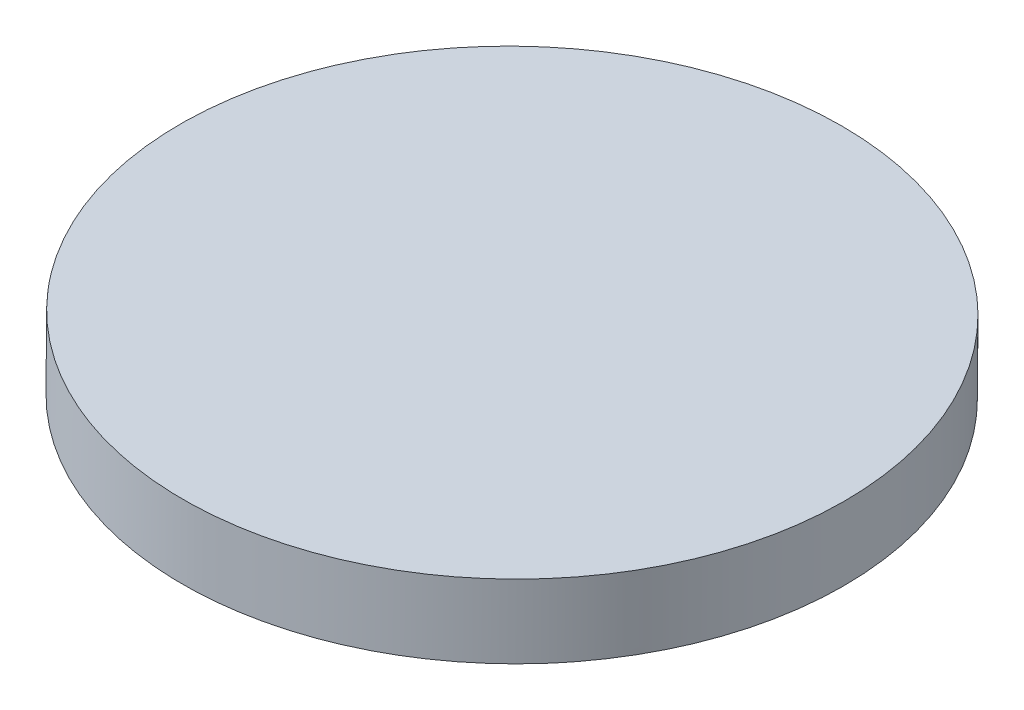
ISO-10303-21;
HEADER;
FILE_DESCRIPTION(('STEP AP214'),'2;1');
FILE_NAME('part.step','',(''),(''),'','','');
FILE_SCHEMA(('AUTOMOTIVE_DESIGN { 1 0 10303 214 1 1 1 1 }'));
ENDSEC;
DATA;
#1=APPLICATION_CONTEXT('core data for automotive mechanical design processes');
#2=APPLICATION_PROTOCOL_DEFINITION('international standard','automotive_design',2000,#1);
#3=PRODUCT_CONTEXT('',#1,'mechanical');
#4=PRODUCT('Part','Part','',(#3));
#5=PRODUCT_RELATED_PRODUCT_CATEGORY('part','',(#4));
#6=PRODUCT_DEFINITION_FORMATION('','',#4);
#7=PRODUCT_DEFINITION_CONTEXT('part definition',#1,'design');
#8=PRODUCT_DEFINITION('design','',#6,#7);
#9=PRODUCT_DEFINITION_SHAPE('','',#8);
#10=(LENGTH_UNIT() NAMED_UNIT(*) SI_UNIT(.MILLI.,.METRE.));
#11=(NAMED_UNIT(*) PLANE_ANGLE_UNIT() SI_UNIT($,.RADIAN.));
#12=(NAMED_UNIT(*) SI_UNIT($,.STERADIAN.) SOLID_ANGLE_UNIT());
#13=UNCERTAINTY_MEASURE_WITH_UNIT(LENGTH_MEASURE(1.E-05),#10,'distance_accuracy_value','');
#14=(GEOMETRIC_REPRESENTATION_CONTEXT(3) GLOBAL_UNCERTAINTY_ASSIGNED_CONTEXT((#13)) GLOBAL_UNIT_ASSIGNED_CONTEXT((#10,
#11,#12)) REPRESENTATION_CONTEXT('',''));
#15=CARTESIAN_POINT('',(0.,0.,0.));
#16=DIRECTION('',(0.,0.,1.));
#17=DIRECTION('',(1.,0.,0.));
#18=AXIS2_PLACEMENT_3D('',#15,#16,#17);
#19=CARTESIAN_POINT('',(-44.4553488898242,495.021376757719,709.143771462423));
#20=CARTESIAN_POINT('',(-42.2007824788043,495.021376757719,709.143771462423));
#21=CARTESIAN_POINT('',(-37.6916496567643,495.025252306551,709.58786537161));
#22=CARTESIAN_POINT('',(-31.1878755921047,495.042468873544,711.560688543134));
#23=CARTESIAN_POINT('',(-25.1939630857917,495.070427061266,714.764379534292));
#24=CARTESIAN_POINT('',(-19.940254834018,495.108052452243,719.075822296944));
#25=CARTESIAN_POINT('',(-15.6286478985858,495.1538991238,724.329330503605));
#26=CARTESIAN_POINT('',(-12.4248349160468,495.206205214061,730.323014780096));
#27=CARTESIAN_POINT('',(-10.4519366226008,495.262960629309,736.826541200968));
#28=CARTESIAN_POINT('',(-9.78577039325101,495.321984290767,743.589982893087));
#29=CARTESIAN_POINT('',(-10.4519366226008,495.381007952224,750.353424585205));
#30=CARTESIAN_POINT('',(-12.4248349160468,495.437763367473,756.856951006077));
#31=CARTESIAN_POINT('',(-15.6286478985858,495.490069457734,762.850635282568));
#32=CARTESIAN_POINT('',(-19.940254834018,495.53591612929,768.104143489229));
#33=CARTESIAN_POINT('',(-25.1939630857917,495.573541520268,772.415586251881));
#34=CARTESIAN_POINT('',(-31.1878755921047,495.60149970799,775.619277243039));
#35=CARTESIAN_POINT('',(-37.6916496567643,495.618716274982,777.592100414563));
#36=CARTESIAN_POINT('',(-44.4553488898243,495.624529598231,778.258241278344));
#37=CARTESIAN_POINT('',(-51.2190481228841,495.618716274982,777.592100414563));
#38=CARTESIAN_POINT('',(-57.7228221875438,495.60149970799,775.619277243039));
#39=CARTESIAN_POINT('',(-63.7167346938568,495.573541520268,772.415586251881));
#40=CARTESIAN_POINT('',(-68.9704429456305,495.53591612929,768.10414348923));
#41=CARTESIAN_POINT('',(-73.2820498810627,495.490069457733,762.850635282568));
#42=CARTESIAN_POINT('',(-76.4858628636017,495.437763367473,756.856951006077));
#43=CARTESIAN_POINT('',(-78.4587611570477,495.381007952224,750.353424585205));
#44=CARTESIAN_POINT('',(-79.1249273863975,495.321984290767,743.589982893087));
#45=CARTESIAN_POINT('',(-78.4587611570477,495.262960629309,736.826541200968));
#46=CARTESIAN_POINT('',(-76.4858628636017,495.206205214061,730.323014780096));
#47=CARTESIAN_POINT('',(-73.2820498810627,495.1538991238,724.329330503605));
#48=CARTESIAN_POINT('',(-68.9704429456305,495.108052452243,719.075822296944));
#49=CARTESIAN_POINT('',(-63.7167346938568,495.070427061266,714.764379534292));
#50=CARTESIAN_POINT('',(-57.7228221875438,495.042468873544,711.560688543134));
#51=CARTESIAN_POINT('',(-51.2190481228842,495.025252306551,709.58786537161));
#52=CARTESIAN_POINT('',(-46.7099153008442,495.021376757719,709.143771462423));
#53=CARTESIAN_POINT('',(-44.4553488898242,495.021376757719,709.143771462423));
#54=B_SPLINE_CURVE_WITH_KNOTS('',3,(#19,#20,#21,#22,#23,#24,#25,#26,#27,#28,#29,#30,#31,#32,#33,
#34,#35,#36,#37,#38,#39,#40,#41,#42,#43,#44,#45,#46,#47,#48,#49,#50,#51,#52,#53),.UNSPECIFIED.,
.T.,.F.,(4,1,1,1,1,1,1,1,1,1,1,1,1,1,1,1,1,1,1,1,1,1,1,1,1,1,1,1,1,1,1,1,4),(0.,0.03125,
0.0625000000000001,0.0937500000000001,0.125,0.15625,0.1875,0.21875,0.25,0.28125,0.3125,0.34375,
0.375,0.40625,0.4375,0.46875,0.5,0.53125,0.5625,0.59375,0.625,0.65625,0.6875,0.71875,0.75,
0.78125,0.8125,0.84375,0.875,0.90625,0.9375,0.96875,1.),.UNSPECIFIED.);
#55=DIRECTION('',(0.,-0.999961923064171,0.00872653549836411));
#56=VECTOR('',#55,1.);
#57=SURFACE_OF_LINEAR_EXTRUSION('',#54,#56);
#58=CARTESIAN_POINT('',(-44.4553488898242,495.021376757719,709.143771462423));
#59=CARTESIAN_POINT('',(-43.9087842156791,495.021376760877,709.143771824278));
#60=CARTESIAN_POINT('',(-43.3622231823304,495.021490642224,709.156821334032));
#61=CARTESIAN_POINT('',(-42.2703354994997,495.021945106356,709.208897765494));
#62=CARTESIAN_POINT('',(-41.7250088594797,495.022285690874,709.247924885654));
#63=CARTESIAN_POINT('',(-40.6368251111505,495.023192506665,709.351835683135));
#64=CARTESIAN_POINT('',(-40.0939680043984,495.023758738081,709.416719376757));
#65=CARTESIAN_POINT('',(-39.0119545200997,495.025115757896,709.572218445554));
#66=CARTESIAN_POINT('',(-38.472798115403,495.025906544646,709.662833631745));
#67=CARTESIAN_POINT('',(-37.3994247616508,495.027711746059,709.869689224927));
#68=CARTESIAN_POINT('',(-36.8652078040942,495.028726160338,709.985929587808));
#69=CARTESIAN_POINT('',(-35.802907247882,495.030975659541,710.2436966649));
#70=CARTESIAN_POINT('',(-35.2748236963346,495.032210746158,710.385223573189));
#71=CARTESIAN_POINT('',(-34.2259744269576,495.034898412772,710.693199662458));
#72=CARTESIAN_POINT('',(-33.7052087228605,495.036350993176,710.8596488902));
#73=CARTESIAN_POINT('',(-32.6721785473863,495.039470475503,711.217106159103));
#74=CARTESIAN_POINT('',(-32.1599140180307,495.041137375963,711.408114032695));
#75=CARTESIAN_POINT('',(-31.1450824868498,495.04468254561,711.814350236992));
#76=CARTESIAN_POINT('',(-30.6425154526424,495.046560814091,712.029578486803));
#77=CARTESIAN_POINT('',(-29.648195668651,495.050524022,712.483717131379));
#78=CARTESIAN_POINT('',(-29.1564429990948,495.052608962962,712.722627701762));
#79=CARTESIAN_POINT('',(-28.1848400818957,495.056980326987,713.223536404612));
#80=CARTESIAN_POINT('',(-27.70498987088,495.05926675067,713.485534608115));
#81=CARTESIAN_POINT('',(-26.7582820416752,495.064035963597,714.032032279505));
#82=CARTESIAN_POINT('',(-26.291424344182,495.066518751641,714.316531610008));
#83=CARTESIAN_POINT('',(-25.371809454715,495.071675779473,714.907468467971));
#84=CARTESIAN_POINT('',(-24.9190521954741,495.074350018347,715.21390589075));
#85=CARTESIAN_POINT('',(-24.0286475567006,495.079883682057,715.848000945463));
#86=CARTESIAN_POINT('',(-23.5910002805642,495.082743108158,716.17565872256));
#87=CARTESIAN_POINT('',(-22.7317632422954,495.088640154032,716.851393248972));
#88=CARTESIAN_POINT('',(-22.3101735476447,495.091677774553,717.199470084083));
#89=CARTESIAN_POINT('',(-21.4840078457913,495.097924350002,717.915256732702));
#90=CARTESIAN_POINT('',(-21.0794317497629,495.101133304035,718.282966443687));
#91=CARTESIAN_POINT('',(-20.2882680455911,495.107715830468,719.037249262107));
#92=CARTESIAN_POINT('',(-19.9016803303821,495.111089401888,719.42382225724));
#93=CARTESIAN_POINT('',(-19.1473687900905,495.117993520037,720.214955836322));
#94=CARTESIAN_POINT('',(-18.7796450773131,495.121524067701,720.619516527333));
#95=CARTESIAN_POINT('',(-18.0638311726939,495.128733632026,721.445650771328));
#96=CARTESIAN_POINT('',(-17.7157410833793,495.132412649462,721.867224413135));
#97=CARTESIAN_POINT('',(-17.0399808260869,495.139910811978,722.72642873429));
#98=CARTESIAN_POINT('',(-16.7123105723105,495.143729956469,723.164059346159));
#99=CARTESIAN_POINT('',(-16.0781913722822,495.151500104157,724.054430081052));
#100=CARTESIAN_POINT('',(-15.77174228086,495.155451106452,724.507170100684));
#101=CARTESIAN_POINT('',(-15.1807829209757,495.16347615843,725.426749974034));
#102=CARTESIAN_POINT('',(-14.8962727571978,495.167550208699,725.893589895015));
#103=CARTESIAN_POINT('',(-14.3497542760586,495.175811688178,726.840261676489));
#104=CARTESIAN_POINT('',(-14.0877460960863,495.179999118078,727.320093616282));
#105=CARTESIAN_POINT('',(-13.5868183194425,495.188477845425,728.291659537811));
#106=CARTESIAN_POINT('',(-13.3478986517324,495.192769142552,728.783393482921));
#107=CARTESIAN_POINT('',(-12.8937427142846,495.201446109444,729.777675406292));
#108=CARTESIAN_POINT('',(-12.6785062689224,495.205831778509,730.280223304328));
#109=CARTESIAN_POINT('',(-12.272254595826,495.21468774189,731.295016193722));
#110=CARTESIAN_POINT('',(-12.0812394489884,495.219158036489,731.807261217461));
#111=CARTESIAN_POINT('',(-11.7237685686181,495.228172810989,732.840252058729));
#112=CARTESIAN_POINT('',(-11.5573130026605,495.232717291397,733.360997934233));
#113=CARTESIAN_POINT('',(-11.2493251864268,495.241870111765,734.409807265088));
#114=CARTESIAN_POINT('',(-11.1077928893873,495.246478451605,734.937870706706));
#115=CARTESIAN_POINT('',(-10.850015995942,495.25574865517,736.000130819575));
#116=CARTESIAN_POINT('',(-10.7337712054503,495.260410518483,736.534327443718));
#117=CARTESIAN_POINT('',(-10.5269077392714,495.269777348968,737.607659905032));
#118=CARTESIAN_POINT('',(-10.4362891076969,495.274482316215,738.146795750703));
#119=CARTESIAN_POINT('',(-10.2807841038224,495.283924546001,739.228768116118));
#120=CARTESIAN_POINT('',(-10.2158979205149,495.288661808778,739.771604663012));
#121=CARTESIAN_POINT('',(-10.1119832182416,495.298157880252,740.85974667481));
#122=CARTESIAN_POINT('',(-10.0729546829733,495.302916688937,741.405052138158));
#123=CARTESIAN_POINT('',(-10.0208760745992,495.312445095391,742.496899371684));
#124=CARTESIAN_POINT('',(-10.0078258030343,495.317214693079,743.043441132385));
#125=CARTESIAN_POINT('',(-10.0078258030343,495.326753888455,744.136524653788));
#126=CARTESIAN_POINT('',(-10.0208760745992,495.331523486142,744.683066414489));
#127=CARTESIAN_POINT('',(-10.0729546829733,495.341051892597,745.774913648015));
#128=CARTESIAN_POINT('',(-10.1119832182416,495.345810701281,746.320219111363));
#129=CARTESIAN_POINT('',(-10.2158979205149,495.355306772756,747.408361123162));
#130=CARTESIAN_POINT('',(-10.2807841038224,495.360044035532,747.951197670055));
#131=CARTESIAN_POINT('',(-10.4362891076969,495.369486265319,749.03317003547));
#132=CARTESIAN_POINT('',(-10.5269077392714,495.374191232565,749.572305881141));
#133=CARTESIAN_POINT('',(-10.7337712054503,495.38355806305,750.645638342455));
#134=CARTESIAN_POINT('',(-10.850015995942,495.388219926364,751.179834966599));
#135=CARTESIAN_POINT('',(-11.1077928893873,495.397490129928,752.242095079467));
#136=CARTESIAN_POINT('',(-11.2493251864268,495.402098469768,752.770158521085));
#137=CARTESIAN_POINT('',(-11.5573130026605,495.411251290136,753.81896785194));
#138=CARTESIAN_POINT('',(-11.7237685686181,495.415795770544,754.339713727445));
#139=CARTESIAN_POINT('',(-12.0812394489884,495.424810545045,755.372704568712));
#140=CARTESIAN_POINT('',(-12.272254595826,495.429280839644,755.884949592452));
#141=CARTESIAN_POINT('',(-12.6785062689224,495.438136803025,756.899742481846));
#142=CARTESIAN_POINT('',(-12.8937427142846,495.442522472089,757.402290379881));
#143=CARTESIAN_POINT('',(-13.3478986517324,495.451199438981,758.396572303252));
#144=CARTESIAN_POINT('',(-13.5868183194426,495.455490736108,758.888306248362));
#145=CARTESIAN_POINT('',(-14.0877460960863,495.463969463456,759.859872169891));
#146=CARTESIAN_POINT('',(-14.3497542760586,495.468156893356,760.339704109684));
#147=CARTESIAN_POINT('',(-14.8962727571979,495.476418372834,761.286375891158));
#148=CARTESIAN_POINT('',(-15.1807829209758,495.480492423104,761.75321581214));
#149=CARTESIAN_POINT('',(-15.77174228086,495.488517475082,762.672795685489));
#150=CARTESIAN_POINT('',(-16.0781913722822,495.492468477377,763.125535705121));
#151=CARTESIAN_POINT('',(-16.7123105723105,495.500238625065,764.015906440015));
#152=CARTESIAN_POINT('',(-17.0399808260869,495.504057769556,764.453537051884));
#153=CARTESIAN_POINT('',(-17.7157410833793,495.511555932072,765.312741373039));
#154=CARTESIAN_POINT('',(-18.063831172694,495.515234949508,765.734315014846));
#155=CARTESIAN_POINT('',(-18.7796450773131,495.522444513833,766.560449258841));
#156=CARTESIAN_POINT('',(-19.1473687900906,495.525975061496,766.965009949851));
#157=CARTESIAN_POINT('',(-19.9016803303822,495.532879179646,767.756143528933));
#158=CARTESIAN_POINT('',(-20.2882680455911,495.536252751066,768.142716524066));
#159=CARTESIAN_POINT('',(-21.0794317497629,495.542835277499,768.896999342486));
#160=CARTESIAN_POINT('',(-21.4840078457913,495.546044231532,769.264709053471));
#161=CARTESIAN_POINT('',(-22.3101735476448,495.552290806981,769.98049570209));
#162=CARTESIAN_POINT('',(-22.7317632422954,495.555328427502,770.328572537201));
#163=CARTESIAN_POINT('',(-23.5910002805643,495.561225473376,771.004307063613));
#164=CARTESIAN_POINT('',(-24.0286475567005,495.564084899477,771.331964840711));
#165=CARTESIAN_POINT('',(-24.9190521954742,495.569618563186,771.966059895423));
#166=CARTESIAN_POINT('',(-25.3718094547154,495.572292802061,772.272497318203));
#167=CARTESIAN_POINT('',(-26.2914243441819,495.577449829893,772.863434176165));
#168=CARTESIAN_POINT('',(-26.7582820416742,495.579932617937,773.147933506668));
#169=CARTESIAN_POINT('',(-27.7049898708811,495.584701830863,773.694431178058));
#170=CARTESIAN_POINT('',(-28.1848400818997,495.586988254547,773.956429381562));
#171=CARTESIAN_POINT('',(-29.1564429990909,495.591359618572,774.457338084411));
#172=CARTESIAN_POINT('',(-29.6481956686361,495.593444559533,774.696248654792));
#173=CARTESIAN_POINT('',(-30.6425154526574,495.597407767443,775.150387299373));
#174=CARTESIAN_POINT('',(-31.1450824869057,495.599286035924,775.365615549191));
#175=CARTESIAN_POINT('',(-32.1599140179749,495.602831205571,775.771851753469));
#176=CARTESIAN_POINT('',(-32.6721785471779,495.60449810603,775.962859627035));
#177=CARTESIAN_POINT('',(-33.7052087230691,495.607617588357,776.320316896009));
#178=CARTESIAN_POINT('',(-34.2259744277357,495.609070168763,776.486766123849));
#179=CARTESIAN_POINT('',(-35.2748236955568,495.611757835374,776.79474221285));
#180=CARTESIAN_POINT('',(-35.8029072449788,495.612992921988,776.936269120774));
#181=CARTESIAN_POINT('',(-36.8652078069976,495.6152424212,777.194036198865));
#182=CARTESIAN_POINT('',(-37.3994247724863,495.61625683549,777.310276563111));
#183=CARTESIAN_POINT('',(-38.4727981045677,495.618062036871,777.517132152563));
#184=CARTESIAN_POINT('',(-39.0119544796614,495.618852823577,777.607747333658));
#185=CARTESIAN_POINT('',(-40.0939680448372,495.620209843513,777.763246416378));
#186=CARTESIAN_POINT('',(-40.6368252620703,495.620776075095,777.828130129019));
#187=CARTESIAN_POINT('',(-41.7250087085601,495.621682890433,777.932040874539));
#188=CARTESIAN_POINT('',(-42.27033493626,495.622023474332,777.97106792372));
#189=CARTESIAN_POINT('',(-43.3622237455659,495.622477940156,778.0231445491));
#190=CARTESIAN_POINT('',(-43.9087863176951,495.622591823814,778.036194323751));
#191=CARTESIAN_POINT('',(-45.0019114619535,495.622591823814,778.036194323751));
#192=CARTESIAN_POINT('',(-45.5484740340826,495.622477940156,778.0231445491));
#193=CARTESIAN_POINT('',(-46.6403628433886,495.622023474332,777.97106792372));
#194=CARTESIAN_POINT('',(-47.1856890710884,495.621682890433,777.932040874539));
#195=CARTESIAN_POINT('',(-48.2738725175783,495.620776075095,777.828130129019));
#196=CARTESIAN_POINT('',(-48.8167297348114,495.620209843513,777.763246416378));
#197=CARTESIAN_POINT('',(-49.8987432999871,495.618852823576,777.607747333658));
#198=CARTESIAN_POINT('',(-50.4378996750809,495.618062036871,777.517132152563));
#199=CARTESIAN_POINT('',(-51.5112730071623,495.61625683549,777.310276563111));
#200=CARTESIAN_POINT('',(-52.045489972651,495.6152424212,777.194036198865));
#201=CARTESIAN_POINT('',(-53.1077905346698,495.612992921988,776.936269120774));
#202=CARTESIAN_POINT('',(-53.6358740840918,495.611757835374,776.79474221285));
#203=CARTESIAN_POINT('',(-54.6847233519129,495.609070168763,776.486766123849));
#204=CARTESIAN_POINT('',(-55.2054890565794,495.607617588357,776.320316896009));
#205=CARTESIAN_POINT('',(-56.2385192324707,495.60449810603,775.962859627035));
#206=CARTESIAN_POINT('',(-56.7507837616736,495.602831205571,775.771851753469));
#207=CARTESIAN_POINT('',(-57.7656152927428,495.599286035924,775.365615549191));
#208=CARTESIAN_POINT('',(-58.2681823269912,495.597407767443,775.150387299373));
#209=CARTESIAN_POINT('',(-59.2625021110124,495.593444559533,774.696248654792));
#210=CARTESIAN_POINT('',(-59.7542547805577,495.591359618572,774.457338084411));
#211=CARTESIAN_POINT('',(-60.7258576977489,495.586988254547,773.956429381562));
#212=CARTESIAN_POINT('',(-61.2057079087674,495.584701830863,773.694431178058));
#213=CARTESIAN_POINT('',(-62.1524157379743,495.579932617937,773.147933506668));
#214=CARTESIAN_POINT('',(-62.6192734354667,495.577449829893,772.863434176165));
#215=CARTESIAN_POINT('',(-63.5388883249332,495.572292802061,772.272497318203));
#216=CARTESIAN_POINT('',(-63.9916455841744,495.569618563186,771.966059895423));
#217=CARTESIAN_POINT('',(-64.882050222948,495.564084899477,771.33196484071));
#218=CARTESIAN_POINT('',(-65.3196974990842,495.561225473376,771.004307063613));
#219=CARTESIAN_POINT('',(-66.1789345373531,495.555328427502,770.328572537201));
#220=CARTESIAN_POINT('',(-66.6005242320038,495.552290806981,769.98049570209));
#221=CARTESIAN_POINT('',(-67.4266899338573,495.546044231532,769.264709053471));
#222=CARTESIAN_POINT('',(-67.8312660298856,495.542835277499,768.896999342486));
#223=CARTESIAN_POINT('',(-68.6224297340574,495.536252751066,768.142716524066));
#224=CARTESIAN_POINT('',(-69.0090174492663,495.532879179646,767.756143528933));
#225=CARTESIAN_POINT('',(-69.763328989558,495.525975061496,766.965009949851));
#226=CARTESIAN_POINT('',(-70.1310527023354,495.522444513832,766.560449258841));
#227=CARTESIAN_POINT('',(-70.8468666069545,495.515234949508,765.734315014846));
#228=CARTESIAN_POINT('',(-71.1949566962692,495.511555932072,765.312741373039));
#229=CARTESIAN_POINT('',(-71.8707169535616,495.504057769556,764.453537051884));
#230=CARTESIAN_POINT('',(-72.198387207338,495.500238625065,764.015906440015));
#231=CARTESIAN_POINT('',(-72.8325064073663,495.492468477377,763.125535705121));
#232=CARTESIAN_POINT('',(-73.1389554987885,495.488517475082,762.672795685489));
#233=CARTESIAN_POINT('',(-73.7299148586728,495.480492423104,761.75321581214));
#234=CARTESIAN_POINT('',(-74.0144250224507,495.476418372834,761.286375891158));
#235=CARTESIAN_POINT('',(-74.5609435035899,495.468156893356,760.339704109684));
#236=CARTESIAN_POINT('',(-74.8229516835622,495.463969463456,759.859872169891));
#237=CARTESIAN_POINT('',(-75.323879460206,495.455490736108,758.888306248362));
#238=CARTESIAN_POINT('',(-75.5627991279161,495.451199438981,758.396572303252));
#239=CARTESIAN_POINT('',(-76.0169550653639,495.442522472089,757.402290379881));
#240=CARTESIAN_POINT('',(-76.2321915107261,495.438136803025,756.899742481846));
#241=CARTESIAN_POINT('',(-76.6384431838225,495.429280839644,755.884949592451));
#242=CARTESIAN_POINT('',(-76.8294583306601,495.424810545045,755.372704568712));
#243=CARTESIAN_POINT('',(-77.1869292110304,495.415795770544,754.339713727444));
#244=CARTESIAN_POINT('',(-77.353384776988,495.411251290136,753.81896785194));
#245=CARTESIAN_POINT('',(-77.6613725932217,495.402098469768,752.770158521085));
#246=CARTESIAN_POINT('',(-77.8029048902612,495.397490129928,752.242095079467));
#247=CARTESIAN_POINT('',(-78.0606817837065,495.388219926364,751.179834966598));
#248=CARTESIAN_POINT('',(-78.1769265741982,495.383558063051,750.645638342455));
#249=CARTESIAN_POINT('',(-78.3837900403771,495.374191232565,749.572305881141));
#250=CARTESIAN_POINT('',(-78.4744086719516,495.369486265319,749.03317003547));
#251=CARTESIAN_POINT('',(-78.6299136758261,495.360044035532,747.951197670055));
#252=CARTESIAN_POINT('',(-78.6947998591336,495.355306772756,747.408361123161));
#253=CARTESIAN_POINT('',(-78.7987145614069,495.345810701281,746.320219111363));
#254=CARTESIAN_POINT('',(-78.8377430966752,495.341051892597,745.774913648015));
#255=CARTESIAN_POINT('',(-78.8898217050493,495.331523486142,744.683066414489));
#256=CARTESIAN_POINT('',(-78.9028719766142,495.326753888455,744.136524653788));
#257=CARTESIAN_POINT('',(-78.9028719766142,495.317214693079,743.043441132385));
#258=CARTESIAN_POINT('',(-78.8898217050493,495.312445095391,742.496899371684));
#259=CARTESIAN_POINT('',(-78.8377430966752,495.302916688937,741.405052138159));
#260=CARTESIAN_POINT('',(-78.7987145614069,495.298157880252,740.85974667481));
#261=CARTESIAN_POINT('',(-78.6947998591336,495.288661808778,739.771604663012));
#262=CARTESIAN_POINT('',(-78.6299136758261,495.283924546001,739.228768116118));
#263=CARTESIAN_POINT('',(-78.4744086719516,495.274482316215,738.146795750704));
#264=CARTESIAN_POINT('',(-78.3837900403771,495.269777348968,737.607659905032));
#265=CARTESIAN_POINT('',(-78.1769265741982,495.260410518483,736.534327443718));
#266=CARTESIAN_POINT('',(-78.0606817837065,495.25574865517,736.000130819575));
#267=CARTESIAN_POINT('',(-77.8029048902612,495.246478451605,734.937870706706));
#268=CARTESIAN_POINT('',(-77.6613725932216,495.241870111765,734.409807265088));
#269=CARTESIAN_POINT('',(-77.353384776988,495.232717291397,733.360997934233));
#270=CARTESIAN_POINT('',(-77.1869292110304,495.228172810989,732.840252058729));
#271=CARTESIAN_POINT('',(-76.8294583306601,495.219158036488,731.807261217461));
#272=CARTESIAN_POINT('',(-76.6384431838225,495.21468774189,731.295016193722));
#273=CARTESIAN_POINT('',(-76.2321915107261,495.205831778509,730.280223304328));
#274=CARTESIAN_POINT('',(-76.0169550653639,495.201446109444,729.777675406292));
#275=CARTESIAN_POINT('',(-75.5627991279161,495.192769142552,728.783393482921));
#276=CARTESIAN_POINT('',(-75.3238794602059,495.188477845425,728.291659537811));
#277=CARTESIAN_POINT('',(-74.8229516835622,495.179999118078,727.320093616282));
#278=CARTESIAN_POINT('',(-74.5609435035899,495.175811688178,726.840261676489));
#279=CARTESIAN_POINT('',(-74.0144250224506,495.1675502087,725.893589895015));
#280=CARTESIAN_POINT('',(-73.7299148586728,495.16347615843,725.426749974033));
#281=CARTESIAN_POINT('',(-73.1389554987885,495.155451106452,724.507170100684));
#282=CARTESIAN_POINT('',(-72.8325064073663,495.151500104157,724.054430081052));
#283=CARTESIAN_POINT('',(-72.198387207338,495.143729956469,723.164059346159));
#284=CARTESIAN_POINT('',(-71.8707169535616,495.139910811978,722.72642873429));
#285=CARTESIAN_POINT('',(-71.1949566962692,495.132412649462,721.867224413134));
#286=CARTESIAN_POINT('',(-70.8468666069545,495.128733632026,721.445650771328));
#287=CARTESIAN_POINT('',(-70.1310527023354,495.121524067701,720.619516527333));
#288=CARTESIAN_POINT('',(-69.7633289895579,495.117993520037,720.214955836322));
#289=CARTESIAN_POINT('',(-69.0090174492663,495.111089401888,719.42382225724));
#290=CARTESIAN_POINT('',(-68.6224297340573,495.107715830468,719.037249262107));
#291=CARTESIAN_POINT('',(-67.8312660298856,495.101133304035,718.282966443687));
#292=CARTESIAN_POINT('',(-67.4266899338572,495.097924350001,717.915256732702));
#293=CARTESIAN_POINT('',(-66.6005242320037,495.091677774553,717.199470084083));
#294=CARTESIAN_POINT('',(-66.1789345373531,495.088640154032,716.851393248972));
#295=CARTESIAN_POINT('',(-65.3196974990842,495.082743108158,716.17565872256));
#296=CARTESIAN_POINT('',(-64.8820502229479,495.079883682057,715.848000945463));
#297=CARTESIAN_POINT('',(-63.9916455841744,495.074350018347,715.21390589075));
#298=CARTESIAN_POINT('',(-63.5388883249334,495.071675779473,714.907468467971));
#299=CARTESIAN_POINT('',(-62.6192734354663,495.066518751641,714.316531610008));
#300=CARTESIAN_POINT('',(-62.1524157379732,495.064035963597,714.032032279505));
#301=CARTESIAN_POINT('',(-61.2057079087685,495.059266750671,713.485534608115));
#302=CARTESIAN_POINT('',(-60.7258576977528,495.056980326987,713.223536404612));
#303=CARTESIAN_POINT('',(-59.7542547805536,495.052608962962,712.722627701762));
#304=CARTESIAN_POINT('',(-59.2625021109974,495.050524022,712.483717131379));
#305=CARTESIAN_POINT('',(-58.2681823270061,495.046560814091,712.029578486803));
#306=CARTESIAN_POINT('',(-57.7656152927986,495.04468254561,711.814350236992));
#307=CARTESIAN_POINT('',(-56.7507837616177,495.041137375963,711.408114032695));
#308=CARTESIAN_POINT('',(-56.2385192322622,495.039470475503,711.217106159103));
#309=CARTESIAN_POINT('',(-55.2054890567879,495.036350993177,710.8596488902));
#310=CARTESIAN_POINT('',(-54.6847233526908,495.034898412772,710.693199662458));
#311=CARTESIAN_POINT('',(-53.6358740833138,495.032210746158,710.385223573189));
#312=CARTESIAN_POINT('',(-53.1077905317664,495.030975659541,710.2436966649));
#313=CARTESIAN_POINT('',(-52.0454899755542,495.028726160338,709.985929587808));
#314=CARTESIAN_POINT('',(-51.5112730179976,495.027711746059,709.869689224927));
#315=CARTESIAN_POINT('',(-50.4378996642454,495.025906544646,709.662833631745));
#316=CARTESIAN_POINT('',(-49.8987432595487,495.025115757896,709.572218445554));
#317=CARTESIAN_POINT('',(-48.81672977525,495.023758738081,709.416719376756));
#318=CARTESIAN_POINT('',(-48.2738726684979,495.023192506665,709.351835683135));
#319=CARTESIAN_POINT('',(-47.1856889201687,495.022285690874,709.247924885654));
#320=CARTESIAN_POINT('',(-46.6403622801487,495.021945106356,709.208897765494));
#321=CARTESIAN_POINT('',(-45.548474597318,495.021490642223,709.156821334032));
#322=CARTESIAN_POINT('',(-45.0019135639693,495.021376760877,709.143771824278));
#323=CARTESIAN_POINT('',(-44.4553488898242,495.021376757719,709.143771462423));
#324=B_SPLINE_CURVE_WITH_KNOTS('',3,(#58,#59,#60,#61,#62,#63,#64,#65,#66,#67,#68,#69,#70,#71,
#72,#73,#74,#75,#76,#77,#78,#79,#80,#81,#82,#83,#84,#85,#86,#87,#88,#89,#90,#91,#92,#93,#94,#95,
#96,#97,#98,#99,#100,#101,#102,#103,#104,#105,#106,#107,#108,#109,#110,#111,#112,#113,#114,#115,
#116,#117,#118,#119,#120,#121,#122,#123,#124,#125,#126,#127,#128,#129,#130,#131,#132,#133,#134,
#135,#136,#137,#138,#139,#140,#141,#142,#143,#144,#145,#146,#147,#148,#149,#150,#151,#152,#153,
#154,#155,#156,#157,#158,#159,#160,#161,#162,#163,#164,#165,#166,#167,#168,#169,#170,#171,#172,
#173,#174,#175,#176,#177,#178,#179,#180,#181,#182,#183,#184,#185,#186,#187,#188,#189,#190,#191,
#192,#193,#194,#195,#196,#197,#198,#199,#200,#201,#202,#203,#204,#205,#206,#207,#208,#209,#210,
#211,#212,#213,#214,#215,#216,#217,#218,#219,#220,#221,#222,#223,#224,#225,#226,#227,#228,#229,
#230,#231,#232,#233,#234,#235,#236,#237,#238,#239,#240,#241,#242,#243,#244,#245,#246,#247,#248,
#249,#250,#251,#252,#253,#254,#255,#256,#257,#258,#259,#260,#261,#262,#263,#264,#265,#266,#267,
#268,#269,#270,#271,#272,#273,#274,#275,#276,#277,#278,#279,#280,#281,#282,#283,#284,#285,#286,
#287,#288,#289,#290,#291,#292,#293,#294,#295,#296,#297,#298,#299,#300,#301,#302,#303,#304,#305,
#306,#307,#308,#309,#310,#311,#312,#313,#314,#315,#316,#317,#318,#319,#320,#321,#322,#323),
.UNSPECIFIED.,.F.,.F.,(4,2,2,2,2,2,2,2,2,2,2,2,2,2,2,2,2,2,2,2,2,2,2,2,2,2,2,2,2,2,2,2,2,2,2,2,
2,2,2,2,2,2,2,2,2,2,2,2,2,2,2,2,2,2,2,2,2,2,2,2,2,2,2,2,2,2,2,2,2,2,2,2,2,2,2,2,2,2,2,2,2,2,2,2,
2,2,2,2,2,2,2,2,2,2,2,2,2,2,2,2,2,2,2,2,2,2,2,2,2,2,2,2,2,2,2,2,2,2,2,2,2,2,2,2,2,2,2,2,2,2,2,2,
4),(0.,1.63953351207137,3.27907954938383,4.91862662038178,6.55816165000279,8.19769385736451,
9.83723864896132,11.4767865168727,13.1163231984082,14.7558544042252,16.395397769004,
18.0349461785,19.6744845782721,21.3140151553127,22.9535569492843,24.5931056326655,
26.2326457551399,27.8721761179458,29.5117162404205,31.1512649238015,32.7908067177732,
34.4303372948136,36.0698756945858,37.7094241040816,39.3489674688603,40.9884986746775,
42.628035356213,44.2675832241243,45.9071280157214,47.5466602230828,49.1861952527039,
50.8257423237019,52.4652883610143,54.1048218730857,55.7443553851571,57.3839014224696,
59.0234484934676,60.6629835230887,62.3025157304503,63.9420605220471,65.5816083899585,
67.221145071494,68.860676277311,70.5002196420898,72.1397680515858,73.779306451358,
75.4188370283984,77.05837882237,78.6979275057509,80.3374676282255,81.9769979910315,
83.6165381135059,85.2560867968871,86.8956285908587,88.5351591678992,90.1746975676714,
91.8142459771674,93.4537893419462,95.0933205477633,96.7328572292988,98.3724050972101,
100.011949888807,101.651482096169,103.29101712579,104.930564196788,106.5701102341,
108.209643746171,109.849177258243,111.488723295555,113.128270366553,114.767805396174,
116.407337603536,118.046882395133,119.686430263044,121.32596694458,122.965498150397,
124.605041515175,126.244589924672,127.884128324444,129.523658901484,131.163200695456,
132.802749378837,134.442289501311,136.081819864117,137.721359986592,139.360908669973,
141.000450463944,142.639981040985,144.279519440757,145.919067850253,147.558611215032,
149.198142420849,150.837679102385,152.477226970296,154.116771761893,155.756303969254,
157.395838998875,159.035386069873,160.674932107186,162.314465619257,163.953999131328,
165.593545168641,167.233092239639,168.87262726926,170.512159476622,172.151704268218,
173.79125213613,175.430788817665,177.070320023483,178.709863388261,180.349411797757,
181.988950197529,183.62848077457,185.268022568541,186.907571251922,188.547111374397,
190.186641737203,191.826181859677,193.465730543059,195.10527233703,196.744802914071,
198.384341313843,200.023889723339,201.663433088118,203.302964293935,204.94250097547,
206.582048843381,208.221593634978,209.86112584234,211.500660871961,213.140207942959,
214.779753980271,216.419287492343),.UNSPECIFIED.);
#325=CARTESIAN_POINT('',(-44.4553488898242,495.021376757719,709.143771462423));
#326=VERTEX_POINT('',#325);
#327=EDGE_CURVE('E9',#326,#326,#324,.T.);
#328=ORIENTED_EDGE('',*,*,#327,.T.);
#329=EDGE_LOOP('',(#328));
#330=FACE_BOUND('',#329,.T.);
#331=CARTESIAN_POINT('',(-44.4553488898243,487.377474392513,709.210478787769));
#332=CARTESIAN_POINT('',(-45.0019135639694,487.377474395671,709.210479149624));
#333=CARTESIAN_POINT('',(-45.5484745973181,487.377588277017,709.223528659379));
#334=CARTESIAN_POINT('',(-46.6403622801488,487.37804274115,709.27560509084));
#335=CARTESIAN_POINT('',(-47.1856889201688,487.378383325667,709.314632211001));
#336=CARTESIAN_POINT('',(-48.273872668498,487.379290141459,709.418543008482));
#337=CARTESIAN_POINT('',(-48.8167297752501,487.379856372875,709.483426702103));
#338=CARTESIAN_POINT('',(-49.8987432595488,487.38121339269,709.638925770901));
#339=CARTESIAN_POINT('',(-50.4378996642455,487.38200417944,709.729540957091));
#340=CARTESIAN_POINT('',(-51.5112730179977,487.383809380853,709.936396550274));
#341=CARTESIAN_POINT('',(-52.0454899755543,487.384823795132,710.052636913155));
#342=CARTESIAN_POINT('',(-53.1077905317665,487.387073294335,710.310403990246));
#343=CARTESIAN_POINT('',(-53.6358740833139,487.388308380952,710.451930898535));
#344=CARTESIAN_POINT('',(-54.6847233526909,487.390996047566,710.759906987805));
#345=CARTESIAN_POINT('',(-55.205489056788,487.39244862797,710.926356215546));
#346=CARTESIAN_POINT('',(-56.2385192322623,487.395568110297,711.283813484449));
#347=CARTESIAN_POINT('',(-56.7507837616178,487.397235010757,711.474821358041));
#348=CARTESIAN_POINT('',(-57.7656152927987,487.400780180403,711.881057562338));
#349=CARTESIAN_POINT('',(-58.2681823270062,487.402658448884,712.096285812149));
#350=CARTESIAN_POINT('',(-59.2625021109975,487.406621656794,712.550424456725));
#351=CARTESIAN_POINT('',(-59.7542547805537,487.408706597756,712.789335027109));
#352=CARTESIAN_POINT('',(-60.7258576977528,487.413077961781,713.290243729959));
#353=CARTESIAN_POINT('',(-61.2057079087686,487.415364385464,713.552241933462));
#354=CARTESIAN_POINT('',(-62.1524157379733,487.42013359839,714.098739604852));
#355=CARTESIAN_POINT('',(-62.6192734354665,487.422616386434,714.383238935354));
#356=CARTESIAN_POINT('',(-63.5388883249335,487.427773414266,714.974175793317));
#357=CARTESIAN_POINT('',(-63.9916455841744,487.430447653141,715.280613216097));
#358=CARTESIAN_POINT('',(-64.882050222948,487.43598131685,715.914708270809));
#359=CARTESIAN_POINT('',(-65.3196974990843,487.438840742952,716.242366047906));
#360=CARTESIAN_POINT('',(-66.1789345373532,487.444737788825,716.918100574319));
#361=CARTESIAN_POINT('',(-66.6005242320038,487.447775409346,717.266177409429));
#362=CARTESIAN_POINT('',(-67.4266899338573,487.454021984795,717.981964058048));
#363=CARTESIAN_POINT('',(-67.8312660298857,487.457230938828,718.349673769034));
#364=CARTESIAN_POINT('',(-68.6224297340574,487.463813465261,719.103956587453));
#365=CARTESIAN_POINT('',(-69.0090174492663,487.467187036681,719.490529582587));
#366=CARTESIAN_POINT('',(-69.763328989558,487.474091154831,720.281663161669));
#367=CARTESIAN_POINT('',(-70.1310527023355,487.477621702495,720.686223852679));
#368=CARTESIAN_POINT('',(-70.8468666069546,487.48483126682,721.512358096674));
#369=CARTESIAN_POINT('',(-71.1949566962692,487.488510284256,721.933931738481));
#370=CARTESIAN_POINT('',(-71.8707169535616,487.496008446772,722.793136059636));
#371=CARTESIAN_POINT('',(-72.1983872073381,487.499827591263,723.230766671505));
#372=CARTESIAN_POINT('',(-72.8325064073664,487.507597738951,724.121137406399));
#373=CARTESIAN_POINT('',(-73.1389554987885,487.511548741246,724.573877426031));
#374=CARTESIAN_POINT('',(-73.7299148586728,487.519573793223,725.49345729938));
#375=CARTESIAN_POINT('',(-74.0144250224507,487.523647843493,725.960297220362));
#376=CARTESIAN_POINT('',(-74.56094350359,487.531909322971,726.906969001835));
#377=CARTESIAN_POINT('',(-74.8229516835622,487.536096752872,727.386800941628));
#378=CARTESIAN_POINT('',(-75.323879460206,487.544575480219,728.358366863158));
#379=CARTESIAN_POINT('',(-75.5627991279161,487.548866777346,728.850100808268));
#380=CARTESIAN_POINT('',(-76.0169550653639,487.557543744238,729.844382731639));
#381=CARTESIAN_POINT('',(-76.2321915107261,487.561929413303,730.346930629674));
#382=CARTESIAN_POINT('',(-76.6384431838225,487.570785376683,731.361723519069));
#383=CARTESIAN_POINT('',(-76.8294583306601,487.575255671282,731.873968542808));
#384=CARTESIAN_POINT('',(-77.1869292110304,487.584270445783,732.906959384075));
#385=CARTESIAN_POINT('',(-77.353384776988,487.588814926191,733.42770525958));
#386=CARTESIAN_POINT('',(-77.6613725932217,487.597967746559,734.476514590434));
#387=CARTESIAN_POINT('',(-77.8029048902612,487.602576086399,735.004578032053));
#388=CARTESIAN_POINT('',(-78.0606817837065,487.611846289964,736.066838144921));
#389=CARTESIAN_POINT('',(-78.1769265741982,487.616508153277,736.601034769065));
#390=CARTESIAN_POINT('',(-78.3837900403771,487.625874983762,737.674367230379));
#391=CARTESIAN_POINT('',(-78.4744086719516,487.630579951009,738.21350307605));
#392=CARTESIAN_POINT('',(-78.6299136758261,487.640022180795,739.295475441465));
#393=CARTESIAN_POINT('',(-78.6947998591336,487.644759443572,739.838311988358));
#394=CARTESIAN_POINT('',(-78.7987145614069,487.654255515046,740.926454000157));
#395=CARTESIAN_POINT('',(-78.8377430966752,487.65901432373,741.471759463505));
#396=CARTESIAN_POINT('',(-78.8898217050493,487.668542730185,742.563606697031));
#397=CARTESIAN_POINT('',(-78.9028719766142,487.673312327873,743.110148457732));
#398=CARTESIAN_POINT('',(-78.9028719766142,487.682851523248,744.203231979134));
#399=CARTESIAN_POINT('',(-78.8898217050493,487.687621120936,744.749773739836));
#400=CARTESIAN_POINT('',(-78.8377430966752,487.697149527391,745.841620973361));
#401=CARTESIAN_POINT('',(-78.7987145614069,487.701908336075,746.386926436709));
#402=CARTESIAN_POINT('',(-78.6947998591336,487.71140440755,747.475068448508));
#403=CARTESIAN_POINT('',(-78.6299136758261,487.716141670326,748.017904995402));
#404=CARTESIAN_POINT('',(-78.4744086719515,487.725583900112,749.099877360816));
#405=CARTESIAN_POINT('',(-78.3837900403771,487.730288867359,749.639013206487));
#406=CARTESIAN_POINT('',(-78.1769265741982,487.739655697844,750.712345667801));
#407=CARTESIAN_POINT('',(-78.0606817837065,487.744317561157,751.246542291945));
#408=CARTESIAN_POINT('',(-77.8029048902612,487.753587764722,752.308802404813));
#409=CARTESIAN_POINT('',(-77.6613725932216,487.758196104562,752.836865846432));
#410=CARTESIAN_POINT('',(-77.353384776988,487.76734892493,753.885675177287));
#411=CARTESIAN_POINT('',(-77.1869292110304,487.771893405338,754.406421052791));
#412=CARTESIAN_POINT('',(-76.8294583306601,487.780908179839,755.439411894059));
#413=CARTESIAN_POINT('',(-76.6384431838225,487.785378474438,755.951656917798));
#414=CARTESIAN_POINT('',(-76.2321915107261,487.794234437818,756.966449807192));
#415=CARTESIAN_POINT('',(-76.0169550653639,487.798620106883,757.468997705228));
#416=CARTESIAN_POINT('',(-75.5627991279161,487.807297073775,758.463279628598));
#417=CARTESIAN_POINT('',(-75.3238794602059,487.811588370902,758.955013573709));
#418=CARTESIAN_POINT('',(-74.8229516835622,487.820067098249,759.926579495238));
#419=CARTESIAN_POINT('',(-74.5609435035899,487.82425452815,760.406411435031));
#420=CARTESIAN_POINT('',(-74.0144250224506,487.832516007628,761.353083216505));
#421=CARTESIAN_POINT('',(-73.7299148586727,487.836590057898,761.819923137486));
#422=CARTESIAN_POINT('',(-73.1389554987884,487.844615109875,762.739503010836));
#423=CARTESIAN_POINT('',(-72.8325064073663,487.84856611217,763.192243030468));
#424=CARTESIAN_POINT('',(-72.198387207338,487.856336259858,764.082613765361));
#425=CARTESIAN_POINT('',(-71.8707169535615,487.86015540435,764.52024437723));
#426=CARTESIAN_POINT('',(-71.1949566962691,487.867653566865,765.379448698385));
#427=CARTESIAN_POINT('',(-70.8468666069545,487.871332584301,765.801022340192));
#428=CARTESIAN_POINT('',(-70.1310527023354,487.878542148626,766.627156584187));
#429=CARTESIAN_POINT('',(-69.7633289895579,487.88207269629,767.031717275198));
#430=CARTESIAN_POINT('',(-69.0090174492663,487.88897681444,767.82285085428));
#431=CARTESIAN_POINT('',(-68.6224297340573,487.89235038586,768.209423849413));
#432=CARTESIAN_POINT('',(-67.8312660298856,487.898932912293,768.963706667833));
#433=CARTESIAN_POINT('',(-67.4266899338572,487.902141866326,769.331416378818));
#434=CARTESIAN_POINT('',(-66.6005242320037,487.908388441775,770.047203027437));
#435=CARTESIAN_POINT('',(-66.178934537353,487.911426062296,770.395279862547));
#436=CARTESIAN_POINT('',(-65.3196974990842,487.917323108169,771.07101438896));
#437=CARTESIAN_POINT('',(-64.882050222948,487.920182534271,771.398672166057));
#438=CARTESIAN_POINT('',(-63.9916455841743,487.92571619798,772.03276722077));
#439=CARTESIAN_POINT('',(-63.5388883249331,487.928390436855,772.339204643549));
#440=CARTESIAN_POINT('',(-62.6192734354666,487.933547464687,772.930141501512));
#441=CARTESIAN_POINT('',(-62.1524157379743,487.936030252731,773.214640832014));
#442=CARTESIAN_POINT('',(-61.2057079087674,487.940799465657,773.761138503405));
#443=CARTESIAN_POINT('',(-60.7258576977488,487.94308588934,774.023136706908));
#444=CARTESIAN_POINT('',(-59.7542547805576,487.947457253365,774.524045409757));
#445=CARTESIAN_POINT('',(-59.2625021110124,487.949542194327,774.762955980139));
#446=CARTESIAN_POINT('',(-58.2681823269911,487.953505402237,775.21709462472));
#447=CARTESIAN_POINT('',(-57.7656152927428,487.955383670718,775.432322874538));
#448=CARTESIAN_POINT('',(-56.7507837616735,487.958928840364,775.838559078815));
#449=CARTESIAN_POINT('',(-56.2385192324706,487.960595740824,776.029566952381));
#450=CARTESIAN_POINT('',(-55.2054890565794,487.963715223151,776.387024221356));
#451=CARTESIAN_POINT('',(-54.6847233519128,487.965167803556,776.553473449196));
#452=CARTESIAN_POINT('',(-53.6358740840918,487.967855470168,776.861449538197));
#453=CARTESIAN_POINT('',(-53.1077905346697,487.969090556782,777.00297644612));
#454=CARTESIAN_POINT('',(-52.0454899726509,487.971340055993,777.260743524211));
#455=CARTESIAN_POINT('',(-51.5112730071622,487.972354470284,777.376983888458));
#456=CARTESIAN_POINT('',(-50.4378996750808,487.974159671665,777.583839477909));
#457=CARTESIAN_POINT('',(-49.8987432999871,487.97495045837,777.674454659004));
#458=CARTESIAN_POINT('',(-48.8167297348113,487.976307478307,777.829953741725));
#459=CARTESIAN_POINT('',(-48.2738725175782,487.976873709889,777.894837454365));
#460=CARTESIAN_POINT('',(-47.1856890710884,487.977780525227,777.998748199885));
#461=CARTESIAN_POINT('',(-46.6403628433885,487.978121109125,778.037775249066));
#462=CARTESIAN_POINT('',(-45.5484740340826,487.97857557495,778.089851874447));
#463=CARTESIAN_POINT('',(-45.0019114619534,487.978689458608,778.102901649097));
#464=CARTESIAN_POINT('',(-43.908786317695,487.978689458608,778.102901649097));
#465=CARTESIAN_POINT('',(-43.3622237455658,487.97857557495,778.089851874447));
#466=CARTESIAN_POINT('',(-42.2703349362599,487.978121109125,778.037775249066));
#467=CARTESIAN_POINT('',(-41.72500870856,487.977780525227,777.998748199885));
#468=CARTESIAN_POINT('',(-40.6368252620702,487.976873709889,777.894837454365));
#469=CARTESIAN_POINT('',(-40.0939680448371,487.976307478307,777.829953741725));
#470=CARTESIAN_POINT('',(-39.0119544796613,487.97495045837,777.674454659004));
#471=CARTESIAN_POINT('',(-38.4727981045676,487.974159671665,777.58383947791));
#472=CARTESIAN_POINT('',(-37.3994247724862,487.972354470284,777.376983888458));
#473=CARTESIAN_POINT('',(-36.8652078069975,487.971340055993,777.260743524211));
#474=CARTESIAN_POINT('',(-35.8029072449787,487.969090556782,777.00297644612));
#475=CARTESIAN_POINT('',(-35.2748236955567,487.967855470168,776.861449538197));
#476=CARTESIAN_POINT('',(-34.2259744277356,487.965167803556,776.553473449196));
#477=CARTESIAN_POINT('',(-33.705208723069,487.963715223151,776.387024221356));
#478=CARTESIAN_POINT('',(-32.6721785471778,487.960595740824,776.029566952381));
#479=CARTESIAN_POINT('',(-32.1599140179749,487.958928840364,775.838559078815));
#480=CARTESIAN_POINT('',(-31.1450824869057,487.955383670718,775.432322874538));
#481=CARTESIAN_POINT('',(-30.6425154526573,487.953505402237,775.21709462472));
#482=CARTESIAN_POINT('',(-29.648195668636,487.949542194327,774.762955980139));
#483=CARTESIAN_POINT('',(-29.1564429990908,487.947457253365,774.524045409757));
#484=CARTESIAN_POINT('',(-28.1848400818996,487.94308588934,774.023136706908));
#485=CARTESIAN_POINT('',(-27.704989870881,487.940799465657,773.761138503405));
#486=CARTESIAN_POINT('',(-26.7582820416741,487.936030252731,773.214640832014));
#487=CARTESIAN_POINT('',(-26.2914243441818,487.933547464687,772.930141501512));
#488=CARTESIAN_POINT('',(-25.3718094547153,487.928390436855,772.339204643549));
#489=CARTESIAN_POINT('',(-24.9190521954741,487.92571619798,772.03276722077));
#490=CARTESIAN_POINT('',(-24.0286475567004,487.920182534271,771.398672166057));
#491=CARTESIAN_POINT('',(-23.5910002805642,487.917323108169,771.07101438896));
#492=CARTESIAN_POINT('',(-22.7317632422954,487.911426062296,770.395279862547));
#493=CARTESIAN_POINT('',(-22.3101735476448,487.908388441775,770.047203027437));
#494=CARTESIAN_POINT('',(-21.4840078457912,487.902141866326,769.331416378818));
#495=CARTESIAN_POINT('',(-21.0794317497628,487.898932912293,768.963706667832));
#496=CARTESIAN_POINT('',(-20.288268045591,487.892350385859,768.209423849413));
#497=CARTESIAN_POINT('',(-19.9016803303821,487.88897681444,767.82285085428));
#498=CARTESIAN_POINT('',(-19.1473687900905,487.88207269629,767.031717275197));
#499=CARTESIAN_POINT('',(-18.779645077313,487.878542148626,766.627156584187));
#500=CARTESIAN_POINT('',(-18.0638311726939,487.871332584302,765.801022340192));
#501=CARTESIAN_POINT('',(-17.7157410833793,487.867653566865,765.379448698385));
#502=CARTESIAN_POINT('',(-17.0399808260869,487.860155404349,764.52024437723));
#503=CARTESIAN_POINT('',(-16.7123105723104,487.856336259859,764.082613765361));
#504=CARTESIAN_POINT('',(-16.0781913722822,487.84856611217,763.192243030468));
#505=CARTESIAN_POINT('',(-15.77174228086,487.844615109875,762.739503010836));
#506=CARTESIAN_POINT('',(-15.1807829209757,487.836590057898,761.819923137486));
#507=CARTESIAN_POINT('',(-14.8962727571978,487.832516007628,761.353083216505));
#508=CARTESIAN_POINT('',(-14.3497542760585,487.82425452815,760.406411435031));
#509=CARTESIAN_POINT('',(-14.0877460960863,487.820067098249,759.926579495238));
#510=CARTESIAN_POINT('',(-13.5868183194425,487.811588370902,758.955013573709));
#511=CARTESIAN_POINT('',(-13.3478986517324,487.807297073775,758.463279628598));
#512=CARTESIAN_POINT('',(-12.8937427142845,487.798620106883,757.468997705228));
#513=CARTESIAN_POINT('',(-12.6785062689223,487.794234437818,756.966449807192));
#514=CARTESIAN_POINT('',(-12.272254595826,487.785378474438,755.951656917798));
#515=CARTESIAN_POINT('',(-12.0812394489884,487.780908179839,755.439411894059));
#516=CARTESIAN_POINT('',(-11.7237685686181,487.771893405338,754.406421052791));
#517=CARTESIAN_POINT('',(-11.5573130026605,487.76734892493,753.885675177287));
#518=CARTESIAN_POINT('',(-11.2493251864268,487.758196104562,752.836865846432));
#519=CARTESIAN_POINT('',(-11.1077928893873,487.753587764722,752.308802404813));
#520=CARTESIAN_POINT('',(-10.850015995942,487.744317561157,751.246542291945));
#521=CARTESIAN_POINT('',(-10.7337712054503,487.739655697844,750.712345667801));
#522=CARTESIAN_POINT('',(-10.5269077392714,487.730288867359,749.639013206487));
#523=CARTESIAN_POINT('',(-10.4362891076969,487.725583900112,749.099877360816));
#524=CARTESIAN_POINT('',(-10.2807841038224,487.716141670326,748.017904995402));
#525=CARTESIAN_POINT('',(-10.2158979205149,487.711404407549,747.475068448508));
#526=CARTESIAN_POINT('',(-10.1119832182416,487.701908336075,746.386926436709));
#527=CARTESIAN_POINT('',(-10.0729546829733,487.697149527391,745.841620973361));
#528=CARTESIAN_POINT('',(-10.0208760745992,487.687621120936,744.749773739835));
#529=CARTESIAN_POINT('',(-10.0078258030343,487.682851523248,744.203231979134));
#530=CARTESIAN_POINT('',(-10.0078258030343,487.673312327873,743.110148457732));
#531=CARTESIAN_POINT('',(-10.0208760745992,487.668542730185,742.563606697031));
#532=CARTESIAN_POINT('',(-10.0729546829733,487.65901432373,741.471759463505));
#533=CARTESIAN_POINT('',(-10.1119832182416,487.654255515046,740.926454000157));
#534=CARTESIAN_POINT('',(-10.2158979205149,487.644759443572,739.838311988358));
#535=CARTESIAN_POINT('',(-10.2807841038224,487.640022180795,739.295475441465));
#536=CARTESIAN_POINT('',(-10.436289107697,487.630579951009,738.21350307605));
#537=CARTESIAN_POINT('',(-10.5269077392714,487.625874983762,737.674367230379));
#538=CARTESIAN_POINT('',(-10.7337712054503,487.616508153277,736.601034769065));
#539=CARTESIAN_POINT('',(-10.850015995942,487.611846289964,736.066838144921));
#540=CARTESIAN_POINT('',(-11.1077928893873,487.602576086399,735.004578032053));
#541=CARTESIAN_POINT('',(-11.2493251864268,487.597967746559,734.476514590434));
#542=CARTESIAN_POINT('',(-11.5573130026605,487.588814926191,733.427705259579));
#543=CARTESIAN_POINT('',(-11.7237685686181,487.584270445783,732.906959384075));
#544=CARTESIAN_POINT('',(-12.0812394489884,487.575255671282,731.873968542808));
#545=CARTESIAN_POINT('',(-12.272254595826,487.570785376684,731.361723519068));
#546=CARTESIAN_POINT('',(-12.6785062689224,487.561929413303,730.346930629674));
#547=CARTESIAN_POINT('',(-12.8937427142846,487.557543744238,729.844382731639));
#548=CARTESIAN_POINT('',(-13.3478986517324,487.548866777346,728.850100808268));
#549=CARTESIAN_POINT('',(-13.5868183194426,487.544575480219,728.358366863157));
#550=CARTESIAN_POINT('',(-14.0877460960864,487.536096752872,727.386800941628));
#551=CARTESIAN_POINT('',(-14.3497542760586,487.531909322971,726.906969001835));
#552=CARTESIAN_POINT('',(-14.8962727571979,487.523647843493,725.960297220362));
#553=CARTESIAN_POINT('',(-15.1807829209758,487.519573793223,725.49345729938));
#554=CARTESIAN_POINT('',(-15.7717422808601,487.511548741246,724.573877426031));
#555=CARTESIAN_POINT('',(-16.0781913722822,487.507597738951,724.121137406399));
#556=CARTESIAN_POINT('',(-16.7123105723105,487.499827591262,723.230766671505));
#557=CARTESIAN_POINT('',(-17.039980826087,487.496008446771,722.793136059636));
#558=CARTESIAN_POINT('',(-17.7157410833794,487.488510284256,721.933931738481));
#559=CARTESIAN_POINT('',(-18.063831172694,487.484831266819,721.512358096674));
#560=CARTESIAN_POINT('',(-18.7796450773131,487.477621702495,720.686223852679));
#561=CARTESIAN_POINT('',(-19.1473687900906,487.474091154831,720.281663161669));
#562=CARTESIAN_POINT('',(-19.9016803303822,487.467187036681,719.490529582586));
#563=CARTESIAN_POINT('',(-20.2882680455911,487.463813465261,719.103956587453));
#564=CARTESIAN_POINT('',(-21.0794317497629,487.457230938828,718.349673769034));
#565=CARTESIAN_POINT('',(-21.4840078457913,487.454021984795,717.981964058048));
#566=CARTESIAN_POINT('',(-22.3101735476448,487.447775409346,717.26617740943));
#567=CARTESIAN_POINT('',(-22.7317632422954,487.444737788825,716.918100574319));
#568=CARTESIAN_POINT('',(-23.5910002805643,487.438840742952,716.242366047906));
#569=CARTESIAN_POINT('',(-24.0286475567006,487.43598131685,715.914708270809));
#570=CARTESIAN_POINT('',(-24.9190521954741,487.430447653141,715.280613216097));
#571=CARTESIAN_POINT('',(-25.3718094547151,487.427773414266,714.974175793317));
#572=CARTESIAN_POINT('',(-26.2914243441821,487.422616386434,714.383238935354));
#573=CARTESIAN_POINT('',(-26.7582820416753,487.42013359839,714.098739604852));
#574=CARTESIAN_POINT('',(-27.7049898708801,487.415364385464,713.552241933462));
#575=CARTESIAN_POINT('',(-28.1848400818957,487.413077961781,713.290243729959));
#576=CARTESIAN_POINT('',(-29.1564429990949,487.408706597756,712.789335027108));
#577=CARTESIAN_POINT('',(-29.6481956686511,487.406621656794,712.550424456725));
#578=CARTESIAN_POINT('',(-30.6425154526424,487.402658448884,712.096285812149));
#579=CARTESIAN_POINT('',(-31.1450824868499,487.400780180403,711.881057562338));
#580=CARTESIAN_POINT('',(-32.1599140180308,487.397235010757,711.474821358041));
#581=CARTESIAN_POINT('',(-32.6721785473863,487.395568110297,711.283813484449));
#582=CARTESIAN_POINT('',(-33.7052087228606,487.39244862797,710.926356215546));
#583=CARTESIAN_POINT('',(-34.2259744269578,487.390996047566,710.759906987805));
#584=CARTESIAN_POINT('',(-35.2748236963347,487.388308380952,710.451930898536));
#585=CARTESIAN_POINT('',(-35.8029072478821,487.387073294335,710.310403990246));
#586=CARTESIAN_POINT('',(-36.8652078040942,487.384823795132,710.052636913155));
#587=CARTESIAN_POINT('',(-37.3994247616509,487.383809380853,709.936396550274));
#588=CARTESIAN_POINT('',(-38.4727981154031,487.38200417944,709.729540957092));
#589=CARTESIAN_POINT('',(-39.0119545200998,487.38121339269,709.638925770901));
#590=CARTESIAN_POINT('',(-40.0939680043985,487.379856372875,709.483426702103));
#591=CARTESIAN_POINT('',(-40.6368251111506,487.379290141459,709.418543008481));
#592=CARTESIAN_POINT('',(-41.7250088594798,487.378383325667,709.314632211001));
#593=CARTESIAN_POINT('',(-42.2703354994998,487.378042741149,709.27560509084));
#594=CARTESIAN_POINT('',(-43.3622231823305,487.377588277017,709.223528659379));
#595=CARTESIAN_POINT('',(-43.9087842156792,487.377474395671,709.210479149624));
#596=CARTESIAN_POINT('',(-44.4553488898243,487.377474392513,709.210478787769));
#597=B_SPLINE_CURVE_WITH_KNOTS('',3,(#331,#332,#333,#334,#335,#336,#337,#338,#339,#340,#341,
#342,#343,#344,#345,#346,#347,#348,#349,#350,#351,#352,#353,#354,#355,#356,#357,#358,#359,#360,
#361,#362,#363,#364,#365,#366,#367,#368,#369,#370,#371,#372,#373,#374,#375,#376,#377,#378,#379,
#380,#381,#382,#383,#384,#385,#386,#387,#388,#389,#390,#391,#392,#393,#394,#395,#396,#397,#398,
#399,#400,#401,#402,#403,#404,#405,#406,#407,#408,#409,#410,#411,#412,#413,#414,#415,#416,#417,
#418,#419,#420,#421,#422,#423,#424,#425,#426,#427,#428,#429,#430,#431,#432,#433,#434,#435,#436,
#437,#438,#439,#440,#441,#442,#443,#444,#445,#446,#447,#448,#449,#450,#451,#452,#453,#454,#455,
#456,#457,#458,#459,#460,#461,#462,#463,#464,#465,#466,#467,#468,#469,#470,#471,#472,#473,#474,
#475,#476,#477,#478,#479,#480,#481,#482,#483,#484,#485,#486,#487,#488,#489,#490,#491,#492,#493,
#494,#495,#496,#497,#498,#499,#500,#501,#502,#503,#504,#505,#506,#507,#508,#509,#510,#511,#512,
#513,#514,#515,#516,#517,#518,#519,#520,#521,#522,#523,#524,#525,#526,#527,#528,#529,#530,#531,
#532,#533,#534,#535,#536,#537,#538,#539,#540,#541,#542,#543,#544,#545,#546,#547,#548,#549,#550,
#551,#552,#553,#554,#555,#556,#557,#558,#559,#560,#561,#562,#563,#564,#565,#566,#567,#568,#569,
#570,#571,#572,#573,#574,#575,#576,#577,#578,#579,#580,#581,#582,#583,#584,#585,#586,#587,#588,
#589,#590,#591,#592,#593,#594,#595,#596),.UNSPECIFIED.,.F.,.F.,(4,2,2,2,2,2,2,2,2,2,2,2,2,2,2,2,
2,2,2,2,2,2,2,2,2,2,2,2,2,2,2,2,2,2,2,2,2,2,2,2,2,2,2,2,2,2,2,2,2,2,2,2,2,2,2,2,2,2,2,2,2,2,2,2,
2,2,2,2,2,2,2,2,2,2,2,2,2,2,2,2,2,2,2,2,2,2,2,2,2,2,2,2,2,2,2,2,2,2,2,2,2,2,2,2,2,2,2,2,2,2,2,2,
2,2,2,2,2,2,2,2,2,2,2,2,2,2,2,2,2,2,2,2,4),(0.,1.63953351207138,3.27907954938384,
4.91862662038177,6.55816165000282,8.1976938573645,9.83723864896136,11.4767865168727,
13.1163231984082,14.7558544042253,16.3953977690041,18.0349461785001,19.6744845782722,
21.3140151553127,22.9535569492843,24.5931056326654,26.2326457551399,27.8721761179459,
29.5117162404204,31.1512649238016,32.7908067177731,34.4303372948137,36.0698756945857,
37.7094241040817,39.3489674688605,40.9884986746776,42.6280353562131,44.2675832241244,
45.9071280157212,47.5466602230831,49.1861952527042,50.8257423237021,52.4652883610144,
54.1048218730858,55.744355385157,57.3839014224695,59.0234484934674,60.6629835230884,
62.3025157304503,63.9420605220471,65.5816083899585,67.221145071494,68.8606762773111,
70.50021964209,72.1397680515858,73.779306451358,75.4188370283984,77.0583788223701,
78.6979275057511,80.3374676282257,81.9769979910315,83.6165381135061,85.256086796887,
86.8956285908589,88.5351591678992,90.1746975676714,91.8142459771674,93.4537893419463,
95.0933205477633,96.7328572292988,98.3724050972101,100.011949888807,101.651482096169,
103.29101712579,104.930564196788,106.5701102341,108.209643746171,109.849177258243,
111.488723295555,113.128270366553,114.767805396174,116.407337603536,118.046882395133,
119.686430263044,121.32596694458,122.965498150397,124.605041515175,126.244589924672,
127.884128324444,129.523658901484,131.163200695456,132.802749378837,134.442289501312,
136.081819864117,137.721359986592,139.360908669973,141.000450463945,142.639981040985,
144.279519440757,145.919067850253,147.558611215032,149.198142420849,150.837679102384,
152.477226970296,154.116771761893,155.756303969254,157.395838998875,159.035386069873,
160.674932107186,162.314465619257,163.953999131328,165.593545168641,167.233092239639,
168.87262726926,170.512159476622,172.151704268218,173.79125213613,175.430788817665,
177.070320023482,178.709863388261,180.349411797757,181.988950197529,183.62848077457,
185.268022568541,186.907571251922,188.547111374397,190.186641737203,191.826181859677,
193.465730543059,195.10527233703,196.744802914071,198.384341313843,200.023889723339,
201.663433088118,203.302964293935,204.94250097547,206.582048843382,208.221593634978,
209.86112584234,211.500660871961,213.140207942959,214.779753980271,216.419287492343),.UNSPECIFIED.);
#598=CARTESIAN_POINT('',(-44.4553488898243,487.377474392513,709.210478787769));
#599=VERTEX_POINT('',#598);
#600=EDGE_CURVE('E24',#599,#599,#597,.F.);
#601=ORIENTED_EDGE('',*,*,#600,.F.);
#602=EDGE_LOOP('',(#601));
#603=FACE_BOUND('',#602,.T.);
#604=ADVANCED_FACE('F14',(#330,#603),#57,.T.);
#605=CARTESIAN_POINT('',(-44.4553488898243,495.654465293254,781.688532161832));
#606=DIRECTION('',(0.,-0.999961923064171,0.00872653549836411));
#607=DIRECTION('',(1.,0.,0.));
#608=AXIS2_PLACEMENT_3D('',#605,#606,#607);
#609=PLANE('',#608);
#610=ORIENTED_EDGE('',*,*,#327,.F.);
#611=EDGE_LOOP('',(#610));
#612=FACE_BOUND('',#611,.T.);
#613=ADVANCED_FACE('F62',(#612),#609,.F.);
#614=CARTESIAN_POINT('',(-44.4553488898243,488.010562928048,781.755239487178));
#615=DIRECTION('',(0.,-0.999961923064171,0.00872653549836411));
#616=DIRECTION('',(1.,0.,0.));
#617=AXIS2_PLACEMENT_3D('',#614,#615,#616);
#618=PLANE('',#617);
#619=ORIENTED_EDGE('',*,*,#600,.T.);
#620=EDGE_LOOP('',(#619));
#621=FACE_BOUND('',#620,.T.);
#622=ADVANCED_FACE('F31',(#621),#618,.T.);
#623=CLOSED_SHELL('',(#604,#613,#622));
#624=MANIFOLD_SOLID_BREP('B1',#623);
#625=ADVANCED_BREP_SHAPE_REPRESENTATION('',(#18,#624),#14);
#626=SHAPE_DEFINITION_REPRESENTATION(#9,#625);
ENDSEC;
END-ISO-10303-21;
